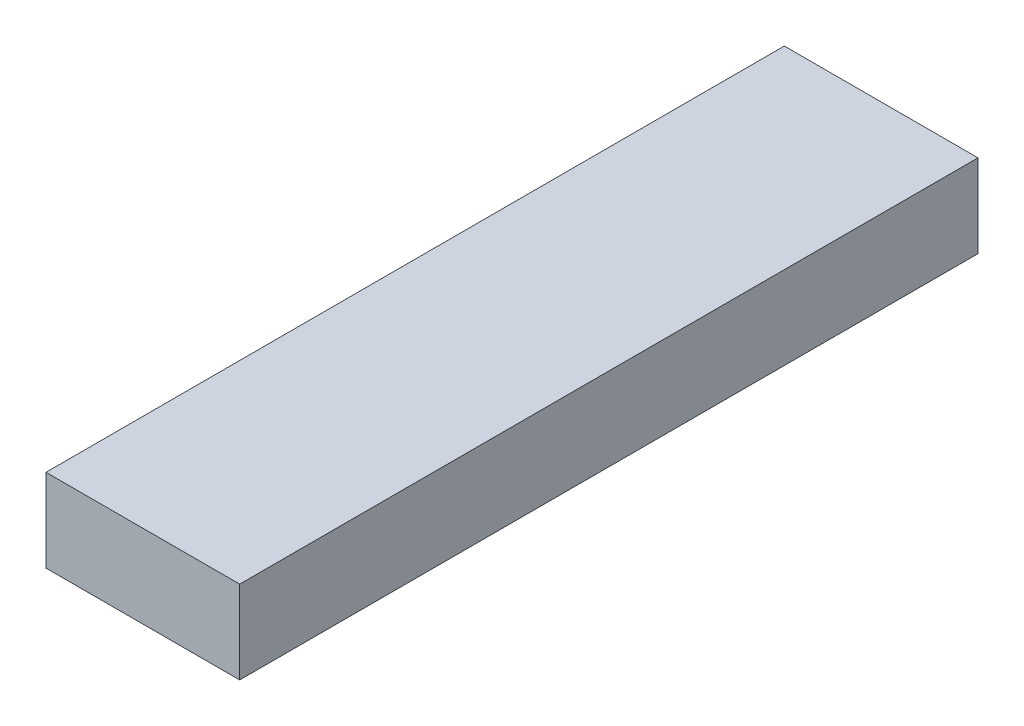
ISO-10303-21;
HEADER;
FILE_DESCRIPTION(('STEP AP214'),'2;1');
FILE_NAME('part.step','',(''),(''),'','','');
FILE_SCHEMA(('AUTOMOTIVE_DESIGN { 1 0 10303 214 1 1 1 1 }'));
ENDSEC;
DATA;
#1=APPLICATION_CONTEXT('core data for automotive mechanical design processes');
#2=APPLICATION_PROTOCOL_DEFINITION('international standard','automotive_design',2000,#1);
#3=PRODUCT_CONTEXT('',#1,'mechanical');
#4=PRODUCT('Part','Part','',(#3));
#5=PRODUCT_RELATED_PRODUCT_CATEGORY('part','',(#4));
#6=PRODUCT_DEFINITION_FORMATION('','',#4);
#7=PRODUCT_DEFINITION_CONTEXT('part definition',#1,'design');
#8=PRODUCT_DEFINITION('design','',#6,#7);
#9=PRODUCT_DEFINITION_SHAPE('','',#8);
#10=(LENGTH_UNIT() NAMED_UNIT(*) SI_UNIT(.MILLI.,.METRE.));
#11=(NAMED_UNIT(*) PLANE_ANGLE_UNIT() SI_UNIT($,.RADIAN.));
#12=(NAMED_UNIT(*) SI_UNIT($,.STERADIAN.) SOLID_ANGLE_UNIT());
#13=UNCERTAINTY_MEASURE_WITH_UNIT(LENGTH_MEASURE(1.E-05),#10,'distance_accuracy_value','');
#14=(GEOMETRIC_REPRESENTATION_CONTEXT(3) GLOBAL_UNCERTAINTY_ASSIGNED_CONTEXT((#13)) GLOBAL_UNIT_ASSIGNED_CONTEXT((#10,
#11,#12)) REPRESENTATION_CONTEXT('',''));
#15=CARTESIAN_POINT('',(0.,0.,0.));
#16=DIRECTION('',(0.,0.,1.));
#17=DIRECTION('',(1.,0.,0.));
#18=AXIS2_PLACEMENT_3D('',#15,#16,#17);
#19=CARTESIAN_POINT('',(44.45,-19.05,338.900008));
#20=DIRECTION('',(-1.,0.,0.));
#21=DIRECTION('',(0.,0.,1.));
#22=AXIS2_PLACEMENT_3D('',#19,#20,#21);
#23=PLANE('',#22);
#24=DIRECTION('',(0.,1.,0.));
#25=VECTOR('',#24,1.);
#26=CARTESIAN_POINT('',(44.45,-19.05,0.));
#27=LINE('',#26,#25);
#28=CARTESIAN_POINT('',(44.45,-19.05,0.));
#29=VERTEX_POINT('',#28);
#30=CARTESIAN_POINT('',(44.45,19.05,0.));
#31=VERTEX_POINT('',#30);
#32=EDGE_CURVE('E107',#29,#31,#27,.T.);
#33=ORIENTED_EDGE('',*,*,#32,.T.);
#34=DIRECTION('',(0.,0.,-1.));
#35=VECTOR('',#34,1.);
#36=CARTESIAN_POINT('',(44.45,19.05,338.900008));
#37=LINE('',#36,#35);
#38=CARTESIAN_POINT('',(44.45,19.05,338.900008));
#39=VERTEX_POINT('',#38);
#40=EDGE_CURVE('E11',#39,#31,#37,.T.);
#41=ORIENTED_EDGE('',*,*,#40,.F.);
#42=DIRECTION('',(0.,1.,0.));
#43=VECTOR('',#42,1.);
#44=CARTESIAN_POINT('',(44.45,-19.05,338.900008));
#45=LINE('',#44,#43);
#46=CARTESIAN_POINT('',(44.45,-19.05,338.900008));
#47=VERTEX_POINT('',#46);
#48=EDGE_CURVE('E91',#47,#39,#45,.T.);
#49=ORIENTED_EDGE('',*,*,#48,.F.);
#50=DIRECTION('',(0.,0.,-1.));
#51=VECTOR('',#50,1.);
#52=CARTESIAN_POINT('',(44.45,-19.05,338.900008));
#53=LINE('',#52,#51);
#54=EDGE_CURVE('E103',#47,#29,#53,.T.);
#55=ORIENTED_EDGE('',*,*,#54,.T.);
#56=EDGE_LOOP('',(#33,#41,#49,#55));
#57=FACE_BOUND('',#56,.T.);
#58=ADVANCED_FACE('F39',(#57),#23,.F.);
#59=CARTESIAN_POINT('',(-44.45,19.05,338.900008));
#60=DIRECTION('',(0.,-1.,0.));
#61=DIRECTION('',(0.,0.,-1.));
#62=AXIS2_PLACEMENT_3D('',#59,#60,#61);
#63=PLANE('',#62);
#64=DIRECTION('',(-1.,0.,0.));
#65=VECTOR('',#64,1.);
#66=CARTESIAN_POINT('',(-44.45,19.05,0.));
#67=LINE('',#66,#65);
#68=CARTESIAN_POINT('',(-44.45,19.05,0.));
#69=VERTEX_POINT('',#68);
#70=EDGE_CURVE('E96',#31,#69,#67,.T.);
#71=ORIENTED_EDGE('',*,*,#70,.T.);
#72=DIRECTION('',(0.,0.,-1.));
#73=VECTOR('',#72,1.);
#74=CARTESIAN_POINT('',(-44.45,19.05,338.900008));
#75=LINE('',#74,#73);
#76=CARTESIAN_POINT('',(-44.45,19.05,338.900008));
#77=VERTEX_POINT('',#76);
#78=EDGE_CURVE('E48',#77,#69,#75,.T.);
#79=ORIENTED_EDGE('',*,*,#78,.F.);
#80=DIRECTION('',(-1.,0.,0.));
#81=VECTOR('',#80,1.);
#82=CARTESIAN_POINT('',(-44.45,19.05,338.900008));
#83=LINE('',#82,#81);
#84=EDGE_CURVE('E86',#39,#77,#83,.T.);
#85=ORIENTED_EDGE('',*,*,#84,.F.);
#86=ORIENTED_EDGE('',*,*,#40,.T.);
#87=EDGE_LOOP('',(#71,#79,#85,#86));
#88=FACE_BOUND('',#87,.T.);
#89=ADVANCED_FACE('F95',(#88),#63,.F.);
#90=CARTESIAN_POINT('',(-44.45,-19.05,338.900008));
#91=DIRECTION('',(1.,0.,0.));
#92=DIRECTION('',(0.,0.,-1.));
#93=AXIS2_PLACEMENT_3D('',#90,#91,#92);
#94=PLANE('',#93);
#95=DIRECTION('',(0.,-1.,0.));
#96=VECTOR('',#95,1.);
#97=CARTESIAN_POINT('',(-44.45,-19.05,0.));
#98=LINE('',#97,#96);
#99=CARTESIAN_POINT('',(-44.45,-19.05,0.));
#100=VERTEX_POINT('',#99);
#101=EDGE_CURVE('E73',#69,#100,#98,.T.);
#102=ORIENTED_EDGE('',*,*,#101,.T.);
#103=DIRECTION('',(0.,0.,-1.));
#104=VECTOR('',#103,1.);
#105=CARTESIAN_POINT('',(-44.45,-19.05,338.900008));
#106=LINE('',#105,#104);
#107=CARTESIAN_POINT('',(-44.45,-19.05,338.900008));
#108=VERTEX_POINT('',#107);
#109=EDGE_CURVE('E98',#108,#100,#106,.T.);
#110=ORIENTED_EDGE('',*,*,#109,.F.);
#111=DIRECTION('',(0.,-1.,0.));
#112=VECTOR('',#111,1.);
#113=CARTESIAN_POINT('',(-44.45,-19.05,338.900008));
#114=LINE('',#113,#112);
#115=EDGE_CURVE('E89',#77,#108,#114,.T.);
#116=ORIENTED_EDGE('',*,*,#115,.F.);
#117=ORIENTED_EDGE('',*,*,#78,.T.);
#118=EDGE_LOOP('',(#102,#110,#116,#117));
#119=FACE_BOUND('',#118,.T.);
#120=ADVANCED_FACE('F99',(#119),#94,.F.);
#121=CARTESIAN_POINT('',(-44.45,-19.05,338.900008));
#122=DIRECTION('',(0.,1.,0.));
#123=DIRECTION('',(0.,0.,1.));
#124=AXIS2_PLACEMENT_3D('',#121,#122,#123);
#125=PLANE('',#124);
#126=DIRECTION('',(1.,0.,0.));
#127=VECTOR('',#126,1.);
#128=CARTESIAN_POINT('',(-44.45,-19.05,0.));
#129=LINE('',#128,#127);
#130=EDGE_CURVE('E79',#100,#29,#129,.T.);
#131=ORIENTED_EDGE('',*,*,#130,.T.);
#132=ORIENTED_EDGE('',*,*,#54,.F.);
#133=DIRECTION('',(1.,0.,0.));
#134=VECTOR('',#133,1.);
#135=CARTESIAN_POINT('',(-44.45,-19.05,338.900008));
#136=LINE('',#135,#134);
#137=EDGE_CURVE('E56',#108,#47,#136,.T.);
#138=ORIENTED_EDGE('',*,*,#137,.F.);
#139=ORIENTED_EDGE('',*,*,#109,.T.);
#140=EDGE_LOOP('',(#131,#132,#138,#139));
#141=FACE_BOUND('',#140,.T.);
#142=ADVANCED_FACE('F120',(#141),#125,.F.);
#143=CARTESIAN_POINT('',(0.,0.,338.900008));
#144=DIRECTION('',(0.,0.,-1.));
#145=DIRECTION('',(-1.,0.,0.));
#146=AXIS2_PLACEMENT_3D('',#143,#144,#145);
#147=PLANE('',#146);
#148=ORIENTED_EDGE('',*,*,#48,.T.);
#149=ORIENTED_EDGE('',*,*,#84,.T.);
#150=ORIENTED_EDGE('',*,*,#115,.T.);
#151=ORIENTED_EDGE('',*,*,#137,.T.);
#152=EDGE_LOOP('',(#148,#149,#150,#151));
#153=FACE_BOUND('',#152,.T.);
#154=ADVANCED_FACE('F87',(#153),#147,.F.);
#155=CARTESIAN_POINT('',(0.,0.,0.));
#156=DIRECTION('',(0.,0.,-1.));
#157=DIRECTION('',(-1.,0.,0.));
#158=AXIS2_PLACEMENT_3D('',#155,#156,#157);
#159=PLANE('',#158);
#160=ORIENTED_EDGE('',*,*,#32,.F.);
#161=ORIENTED_EDGE('',*,*,#130,.F.);
#162=ORIENTED_EDGE('',*,*,#101,.F.);
#163=ORIENTED_EDGE('',*,*,#70,.F.);
#164=EDGE_LOOP('',(#160,#161,#162,#163));
#165=FACE_BOUND('',#164,.T.);
#166=ADVANCED_FACE('F123',(#165),#159,.T.);
#167=CLOSED_SHELL('',(#58,#89,#120,#142,#154,#166));
#168=MANIFOLD_SOLID_BREP('B2',#167);
#169=ADVANCED_BREP_SHAPE_REPRESENTATION('',(#18,#168),#14);
#170=SHAPE_DEFINITION_REPRESENTATION(#9,#169);
ENDSEC;
END-ISO-10303-21;
